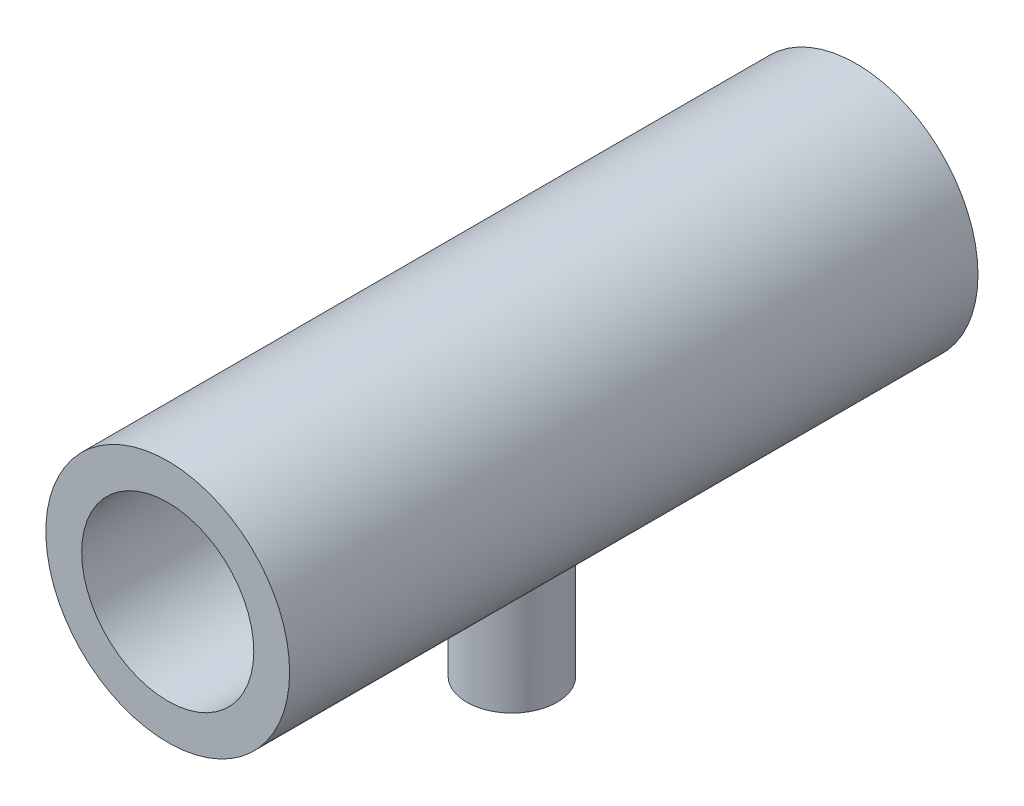
ISO-10303-21;
HEADER;
FILE_DESCRIPTION(('STEP AP214'),'2;1');
FILE_NAME('part.step','',(''),(''),'','','');
FILE_SCHEMA(('AUTOMOTIVE_DESIGN { 1 0 10303 214 1 1 1 1 }'));
ENDSEC;
DATA;
#1=APPLICATION_CONTEXT('core data for automotive mechanical design processes');
#2=APPLICATION_PROTOCOL_DEFINITION('international standard','automotive_design',2000,#1);
#3=PRODUCT_CONTEXT('',#1,'mechanical');
#4=PRODUCT('Part','Part','',(#3));
#5=PRODUCT_RELATED_PRODUCT_CATEGORY('part','',(#4));
#6=PRODUCT_DEFINITION_FORMATION('','',#4);
#7=PRODUCT_DEFINITION_CONTEXT('part definition',#1,'design');
#8=PRODUCT_DEFINITION('design','',#6,#7);
#9=PRODUCT_DEFINITION_SHAPE('','',#8);
#10=(LENGTH_UNIT() NAMED_UNIT(*) SI_UNIT(.MILLI.,.METRE.));
#11=(NAMED_UNIT(*) PLANE_ANGLE_UNIT() SI_UNIT($,.RADIAN.));
#12=(NAMED_UNIT(*) SI_UNIT($,.STERADIAN.) SOLID_ANGLE_UNIT());
#13=UNCERTAINTY_MEASURE_WITH_UNIT(LENGTH_MEASURE(1.E-05),#10,'distance_accuracy_value','');
#14=(GEOMETRIC_REPRESENTATION_CONTEXT(3) GLOBAL_UNCERTAINTY_ASSIGNED_CONTEXT((#13)) GLOBAL_UNIT_ASSIGNED_CONTEXT((#10,
#11,#12)) REPRESENTATION_CONTEXT('',''));
#15=CARTESIAN_POINT('',(0.,0.,0.));
#16=DIRECTION('',(0.,0.,1.));
#17=DIRECTION('',(1.,0.,0.));
#18=AXIS2_PLACEMENT_3D('',#15,#16,#17);
#19=CARTESIAN_POINT('',(0.,0.,0.));
#20=DIRECTION('',(0.,0.,1.));
#21=DIRECTION('',(1.,0.,0.));
#22=AXIS2_PLACEMENT_3D('',#19,#20,#21);
#23=PLANE('',#22);
#24=CARTESIAN_POINT('',(0.,0.,0.));
#25=DIRECTION('',(0.,0.,1.));
#26=DIRECTION('',(1.,0.,0.));
#27=AXIS2_PLACEMENT_3D('',#24,#25,#26);
#28=CIRCLE('',#27,9.525);
#29=CARTESIAN_POINT('',(9.525,0.,0.));
#30=VERTEX_POINT('',#29);
#31=EDGE_CURVE('E72',#30,#30,#28,.F.);
#32=ORIENTED_EDGE('',*,*,#31,.F.);
#33=EDGE_LOOP('',(#32));
#34=FACE_BOUND('',#33,.T.);
#35=CARTESIAN_POINT('',(0.,0.,0.));
#36=DIRECTION('',(0.,0.,1.));
#37=DIRECTION('',(1.,0.,0.));
#38=AXIS2_PLACEMENT_3D('',#35,#36,#37);
#39=CIRCLE('',#38,13.49375);
#40=CARTESIAN_POINT('',(13.49375,0.,0.));
#41=VERTEX_POINT('',#40);
#42=EDGE_CURVE('E63',#41,#41,#39,.T.);
#43=ORIENTED_EDGE('',*,*,#42,.F.);
#44=EDGE_LOOP('',(#43));
#45=FACE_BOUND('',#44,.T.);
#46=ADVANCED_FACE('F48',(#34,#45),#23,.F.);
#47=CARTESIAN_POINT('',(0.,0.,76.2));
#48=DIRECTION('',(0.,0.,1.));
#49=DIRECTION('',(1.,0.,0.));
#50=AXIS2_PLACEMENT_3D('',#47,#48,#49);
#51=PLANE('',#50);
#52=CARTESIAN_POINT('',(0.,0.,76.2));
#53=DIRECTION('',(0.,0.,1.));
#54=DIRECTION('',(1.,0.,0.));
#55=AXIS2_PLACEMENT_3D('',#52,#53,#54);
#56=CIRCLE('',#55,9.525);
#57=CARTESIAN_POINT('',(9.525,0.,76.2));
#58=VERTEX_POINT('',#57);
#59=EDGE_CURVE('E67',#58,#58,#56,.F.);
#60=ORIENTED_EDGE('',*,*,#59,.T.);
#61=EDGE_LOOP('',(#60));
#62=FACE_BOUND('',#61,.T.);
#63=CARTESIAN_POINT('',(0.,0.,76.2));
#64=DIRECTION('',(0.,0.,1.));
#65=DIRECTION('',(1.,0.,0.));
#66=AXIS2_PLACEMENT_3D('',#63,#64,#65);
#67=CIRCLE('',#66,13.49375);
#68=CARTESIAN_POINT('',(13.49375,0.,76.2));
#69=VERTEX_POINT('',#68);
#70=EDGE_CURVE('E59',#69,#69,#67,.T.);
#71=ORIENTED_EDGE('',*,*,#70,.T.);
#72=EDGE_LOOP('',(#71));
#73=FACE_BOUND('',#72,.T.);
#74=ADVANCED_FACE('F107',(#62,#73),#51,.T.);
#75=CARTESIAN_POINT('',(0.,0.,0.));
#76=DIRECTION('',(0.,0.,1.));
#77=DIRECTION('',(1.,0.,0.));
#78=AXIS2_PLACEMENT_3D('',#75,#76,#77);
#79=CYLINDRICAL_SURFACE('',#78,13.49375);
#80=CARTESIAN_POINT('',(0.,-13.49375,33.1));
#81=CARTESIAN_POINT('',(0.135472263766896,-13.4937504047586,33.099999447523));
#82=CARTESIAN_POINT('',(0.270936719021856,-13.4917054381509,33.1055100519968));
#83=CARTESIAN_POINT('',(0.540897583804265,-13.4835810536506,33.127498171873));
#84=CARTESIAN_POINT('',(0.675393664825697,-13.477500326371,33.1439792466075));
#85=CARTESIAN_POINT('',(0.942310386844938,-13.4614712549176,33.1877365253395));
#86=CARTESIAN_POINT('',(1.07473204519487,-13.4515248725417,33.215007253776));
#87=CARTESIAN_POINT('',(1.3366805352037,-13.4280258235397,33.2800924699581));
#88=CARTESIAN_POINT('',(1.46620622177745,-13.4144717568233,33.3179110514468));
#89=CARTESIAN_POINT('',(1.72114562784744,-13.3841465762195,33.4036508748567));
#90=CARTESIAN_POINT('',(1.84656821819204,-13.3673830252288,33.4515483923419));
#91=CARTESIAN_POINT('',(2.09283666142042,-13.3310484918267,33.5570921209125));
#92=CARTESIAN_POINT('',(2.21368079728954,-13.3114764690991,33.6147419458766));
#93=CARTESIAN_POINT('',(2.5681876023103,-13.2492666322519,33.8016694459962));
#94=CARTESIAN_POINT('',(2.79402331790806,-13.203110276009,33.9449924254238));
#95=CARTESIAN_POINT('',(3.22723300149498,-13.1041075203142,34.2709870793335));
#96=CARTESIAN_POINT('',(3.43359656584444,-13.0510751054286,34.4549331911834));
#97=CARTESIAN_POINT('',(3.8134577813909,-12.9451815395335,34.8544787922298));
#98=CARTESIAN_POINT('',(3.98694571510977,-12.8923204436871,35.0700876070615));
#99=CARTESIAN_POINT('',(4.22192057027709,-12.8165445656587,35.4174669978948));
#100=CARTESIAN_POINT('',(4.2971468004325,-12.7914536359554,35.5396919216222));
#101=CARTESIAN_POINT('',(4.43697685467614,-12.7436249861082,35.7904945294159));
#102=CARTESIAN_POINT('',(4.50158493073593,-12.7208863253716,35.9190696436333));
#103=CARTESIAN_POINT('',(4.61963908887273,-12.6784921854404,36.1817508789962));
#104=CARTESIAN_POINT('',(4.67308378857885,-12.6588370881613,36.3158576826765));
#105=CARTESIAN_POINT('',(4.76827655397109,-12.6232884382921,36.588582441897));
#106=CARTESIAN_POINT('',(4.81003022532708,-12.6073930835323,36.7271981997519));
#107=CARTESIAN_POINT('',(4.88000904594543,-12.5804670360074,37.0023419146719));
#108=CARTESIAN_POINT('',(4.90870664494604,-12.5692678542398,37.1387332582223));
#109=CARTESIAN_POINT('',(4.95462966434852,-12.5512367805003,37.4136633746138));
#110=CARTESIAN_POINT('',(4.97186007452148,-12.5444029890481,37.5522011865635));
#111=CARTESIAN_POINT('',(4.99467392479897,-12.5353369675417,37.8303637758437));
#112=CARTESIAN_POINT('',(5.00025899542194,-12.5331040932921,37.9699883982566));
#113=CARTESIAN_POINT('',(4.99972257812551,-12.5333181640281,38.2492087065206));
#114=CARTESIAN_POINT('',(4.99360152939513,-12.5357649334432,38.3888043932609));
#115=CARTESIAN_POINT('',(4.97042394304303,-12.5449717730697,38.6586993792835));
#116=CARTESIAN_POINT('',(4.95402783840827,-12.5514712368139,38.7890649312953));
#117=CARTESIAN_POINT('',(4.91107966929416,-12.5683378809915,39.0478999017767));
#118=CARTESIAN_POINT('',(4.88452422622037,-12.5787063480741,39.1763686746752));
#119=CARTESIAN_POINT('',(4.8215094087587,-12.6029946931011,39.4304780344342));
#120=CARTESIAN_POINT('',(4.78505262824303,-12.6169136408613,39.5561193526868));
#121=CARTESIAN_POINT('',(4.7025551218034,-12.6478930163703,39.8038330522736));
#122=CARTESIAN_POINT('',(4.65651072108387,-12.664954648374,39.9259040446338));
#123=CARTESIAN_POINT('',(4.50266181669429,-12.720826626554,40.2900162032141));
#124=CARTESIAN_POINT('',(4.38026596576647,-12.7638674382975,40.5254355046147));
#125=CARTESIAN_POINT('',(4.10066395296738,-12.8564171799128,40.9730385980973));
#126=CARTESIAN_POINT('',(3.94344597502435,-12.9059283029894,41.1852144664523));
#127=CARTESIAN_POINT('',(3.58648022226262,-13.0098101229415,41.5950970557192));
#128=CARTESIAN_POINT('',(3.38462135054272,-13.0642867142455,41.7909459533316));
#129=CARTESIAN_POINT('',(2.950296940384,-13.1691645737841,42.1465478433897));
#130=CARTESIAN_POINT('',(2.71782692563034,-13.2195652442472,42.3062955474042));
#131=CARTESIAN_POINT('',(2.22422044759276,-13.3115737219616,42.5871608199889));
#132=CARTESIAN_POINT('',(1.9627110968935,-13.3530405701806,42.7076725782912));
#133=CARTESIAN_POINT('',(1.4212133077671,-13.4214661858779,42.9023782024899));
#134=CARTESIAN_POINT('',(1.14123293301017,-13.4484312377894,42.976592134038));
#135=CARTESIAN_POINT('',(0.586406554196147,-13.4837175041064,43.073051856204));
#136=CARTESIAN_POINT('',(0.312052907850673,-13.4929367871492,43.0978035133882));
#137=CARTESIAN_POINT('',(-0.237009928274288,-13.4944588786964,43.1019149110087));
#138=CARTESIAN_POINT('',(-0.511719028675213,-13.4867653329117,43.0812844339678));
#139=CARTESIAN_POINT('',(-1.04295655533747,-13.4559189210102,42.9971306584322));
#140=CARTESIAN_POINT('',(-1.29978084921344,-13.4333538854439,42.9352373339997));
#141=CARTESIAN_POINT('',(-1.79922685014387,-13.3756242291879,42.7724517274125));
#142=CARTESIAN_POINT('',(-2.04184670441226,-13.3404579690716,42.6715543706764));
#143=CARTESIAN_POINT('',(-2.5139137969109,-13.2597347374392,42.430417550935));
#144=CARTESIAN_POINT('',(-2.74277192112757,-13.2139050720553,42.2891182591343));
#145=CARTESIAN_POINT('',(-3.17426860006701,-13.116947321847,41.9724344164635));
#146=CARTESIAN_POINT('',(-3.37689759533655,-13.0658173174219,41.7970374963324));
#147=CARTESIAN_POINT('',(-3.76227648795759,-12.9602748304356,41.4052769874546));
#148=CARTESIAN_POINT('',(-3.94325120576829,-12.905840409654,41.1871561418677));
#149=CARTESIAN_POINT('',(-4.18545795646225,-12.8285014878535,40.8389821660475));
#150=CARTESIAN_POINT('',(-4.26135430699551,-12.8034269163174,40.7193474775108));
#151=CARTESIAN_POINT('',(-4.40287806593898,-12.7554508690349,40.4737555070419));
#152=CARTESIAN_POINT('',(-4.46850980156466,-12.7325484791812,40.3478009191052));
#153=CARTESIAN_POINT('',(-4.5892026737336,-12.6895482297063,40.0898688497315));
#154=CARTESIAN_POINT('',(-4.64422253384034,-12.6694614011826,39.9578702266958));
#155=CARTESIAN_POINT('',(-4.74286096791881,-12.632866941956,39.6892536960719));
#156=CARTESIAN_POINT('',(-4.78648437385461,-12.6163577948656,39.5526377740031));
#157=CARTESIAN_POINT('',(-4.86190286498263,-12.587486751904,39.2757883122811));
#158=CARTESIAN_POINT('',(-4.89370132181523,-12.5751236739656,39.1355558160331));
#159=CARTESIAN_POINT('',(-4.94513304983775,-12.5549876361743,38.8525544176311));
#160=CARTESIAN_POINT('',(-4.96476714150038,-12.5472143667457,38.7097856872115));
#161=CARTESIAN_POINT('',(-4.99079417786854,-12.5368833105471,38.4319578776377));
#162=CARTESIAN_POINT('',(-4.99794393771503,-12.5340275838622,38.2969802656033));
#163=CARTESIAN_POINT('',(-5.00128971675748,-12.5326930349103,38.0268192673743));
#164=CARTESIAN_POINT('',(-4.99748203859668,-12.534215690036,37.8916358271095));
#165=CARTESIAN_POINT('',(-4.9789493896406,-12.541588827641,37.6222038699998));
#166=CARTESIAN_POINT('',(-4.96422951291793,-12.5474372907278,37.4879549464078));
#167=CARTESIAN_POINT('',(-4.9240268362425,-12.5632684466323,37.2212780101522));
#168=CARTESIAN_POINT('',(-4.89853998441636,-12.5732526958188,37.088850702399));
#169=CARTESIAN_POINT('',(-4.83796233915873,-12.5966833351778,36.8306803485185));
#170=CARTESIAN_POINT('',(-4.80317748698354,-12.610018741079,36.7048554069793));
#171=CARTESIAN_POINT('',(-4.72401808055802,-12.6398862263632,36.4566343272629));
#172=CARTESIAN_POINT('',(-4.67964016111743,-12.6564194272988,36.3342394093808));
#173=CARTESIAN_POINT('',(-4.53263275739436,-12.7101325245137,35.9733632413683));
#174=CARTESIAN_POINT('',(-4.41608371340164,-12.7514446125416,35.7409967078595));
#175=CARTESIAN_POINT('',(-4.14240107893058,-12.8430380172178,35.2867185258127));
#176=CARTESIAN_POINT('',(-3.98348611330648,-12.8936717431821,35.0659620651607));
#177=CARTESIAN_POINT('',(-3.63217475789984,-12.9969996592144,34.6531653524389));
#178=CARTESIAN_POINT('',(-3.43976785609895,-13.0496944921582,34.461134151575));
#179=CARTESIAN_POINT('',(-3.12414362977029,-13.1275911234132,34.1935745921251));
#180=CARTESIAN_POINT('',(-3.01127612341515,-13.154001921601,34.1059203707229));
#181=CARTESIAN_POINT('',(-2.77821796099427,-13.2051884019923,33.940444963254));
#182=CARTESIAN_POINT('',(-2.65803001642271,-13.2299646826233,33.8626201687993));
#183=CARTESIAN_POINT('',(-2.41102079712997,-13.2772018975091,33.7173610457256));
#184=CARTESIAN_POINT('',(-2.28419628779173,-13.2996616865758,33.649931848234));
#185=CARTESIAN_POINT('',(-2.0248629087671,-13.3416063969366,33.5260995765089));
#186=CARTESIAN_POINT('',(-1.89235649929868,-13.3610925894412,33.4696917877226));
#187=CARTESIAN_POINT('',(-1.61796678035203,-13.3971361946398,33.3666735424351));
#188=CARTESIAN_POINT('',(-1.47591786073427,-13.413571808727,33.3204604220857));
#189=CARTESIAN_POINT('',(-1.18790920127706,-13.4421386015475,33.2408661531572));
#190=CARTESIAN_POINT('',(-1.04195119017276,-13.4542716502905,33.207479429357));
#191=CARTESIAN_POINT('',(-0.747343776928926,-13.473847107025,33.1539015860132));
#192=CARTESIAN_POINT('',(-0.598694803411213,-13.4812902553869,33.1337083836579));
#193=CARTESIAN_POINT('',(-0.300027270267447,-13.4912412328825,33.1067585632716));
#194=CARTESIAN_POINT('',(-0.150008848047401,-13.4937495518096,33.1000006117595));
#195=CARTESIAN_POINT('',(0.,-13.49375,33.1));
#196=B_SPLINE_CURVE_WITH_KNOTS('',3,(#80,#81,#82,#83,#84,#85,#86,#87,#88,#89,#90,#91,#92,#93,
#94,#95,#96,#97,#98,#99,#100,#101,#102,#103,#104,#105,#106,#107,#108,#109,#110,#111,#112,#113,
#114,#115,#116,#117,#118,#119,#120,#121,#122,#123,#124,#125,#126,#127,#128,#129,#130,#131,#132,
#133,#134,#135,#136,#137,#138,#139,#140,#141,#142,#143,#144,#145,#146,#147,#148,#149,#150,#151,
#152,#153,#154,#155,#156,#157,#158,#159,#160,#161,#162,#163,#164,#165,#166,#167,#168,#169,#170,
#171,#172,#173,#174,#175,#176,#177,#178,#179,#180,#181,#182,#183,#184,#185,#186,#187,#188,#189,
#190,#191,#192,#193,#194,#195),.UNSPECIFIED.,.T.,.F.,(4,2,2,2,2,2,2,2,2,2,2,2,2,2,2,2,2,2,2,2,2,
2,2,2,2,2,2,2,2,2,2,2,2,2,2,2,2,2,2,2,2,2,2,2,2,2,2,2,2,2,2,2,2,2,2,2,2,4),(0.,
0.406276461308086,0.81268480193363,1.21888716141383,1.62524739261097,2.03066159815814,
2.43622636706026,3.24672983203674,4.08763877565035,4.92879589128016,5.36543558124401,
5.80189999335569,6.23841842124705,6.67472718537942,7.09366427416523,7.51241894951417,
7.93111498912467,8.34979532044742,8.7439915077748,9.13831890329272,9.53254309559061,
9.92691866735019,10.7295487052551,11.5324515152231,12.3879407855303,13.2435552945733,
14.1118150012539,14.9796981390084,15.8023690098814,16.6248625641038,17.4166517699387,
18.2085440254211,19.0234901503946,19.8387324588731,20.7001343967812,21.1313519325892,
21.5623871887543,21.995066625698,22.4275623127628,22.8599345878774,23.2922776967941,
23.6973610795579,24.1025811652061,24.5076122035524,24.9127958008545,25.3060102492091,
25.6993628593184,26.4854747123482,27.312082004202,28.1389492102839,28.5744922438891,
29.0098749217897,29.44547181544,29.880881966867,30.3310647374999,30.7810516061912,
31.2309674199674,31.6808385762837),.UNSPECIFIED.);
#197=CARTESIAN_POINT('',(0.,-13.49375,33.1));
#198=VERTEX_POINT('',#197);
#199=EDGE_CURVE('E11',#198,#198,#196,.T.);
#200=ORIENTED_EDGE('',*,*,#199,.F.);
#201=EDGE_LOOP('',(#200));
#202=FACE_BOUND('',#201,.T.);
#203=ORIENTED_EDGE('',*,*,#70,.F.);
#204=EDGE_LOOP('',(#203));
#205=FACE_BOUND('',#204,.T.);
#206=ORIENTED_EDGE('',*,*,#42,.T.);
#207=EDGE_LOOP('',(#206));
#208=FACE_BOUND('',#207,.T.);
#209=ADVANCED_FACE('F103',(#202,#205,#208),#79,.T.);
#210=CARTESIAN_POINT('',(0.,0.,-4.99999999999999));
#211=DIRECTION('',(0.,0.,1.));
#212=DIRECTION('',(1.,0.,0.));
#213=AXIS2_PLACEMENT_3D('',#210,#211,#212);
#214=CYLINDRICAL_SURFACE('',#213,9.525);
#215=CARTESIAN_POINT('',(0.,-9.525,34.37));
#216=CARTESIAN_POINT('',(-0.100651405892543,-9.52500052462911,34.3699992983465));
#217=CARTESIAN_POINT('',(-0.201293680645754,-9.52340118028469,34.3740772253932));
#218=CARTESIAN_POINT('',(-0.401852755465586,-9.51704824657607,34.3903451657601));
#219=CARTESIAN_POINT('',(-0.501769328071407,-9.51229370803081,34.402537620187));
#220=CARTESIAN_POINT('',(-0.700046994451151,-9.49975872031225,34.4349059259878));
#221=CARTESIAN_POINT('',(-0.798409016376606,-9.49198015361161,34.4550768108848));
#222=CARTESIAN_POINT('',(-0.992955517367152,-9.47360744939083,34.503195969695));
#223=CARTESIAN_POINT('',(-1.08913913258594,-9.46301221542522,34.5311472724953));
#224=CARTESIAN_POINT('',(-1.37295527648324,-9.42744743788297,34.6261626146281));
#225=CARTESIAN_POINT('',(-1.55647984698465,-9.39865664754902,34.7044918931667));
#226=CARTESIAN_POINT('',(-1.90765108699512,-9.3337296647856,34.8885877253639));
#227=CARTESIAN_POINT('',(-2.07529310531261,-9.29759133032194,34.9943622826512));
#228=CARTESIAN_POINT('',(-2.39774379721645,-9.2198189773798,35.2354111963065));
#229=CARTESIAN_POINT('',(-2.55173966680187,-9.17801992588785,35.3717210145505));
#230=CARTESIAN_POINT('',(-2.83534678381793,-9.09441285181886,35.6677654843873));
#231=CARTESIAN_POINT('',(-2.96494955385709,-9.05260483115968,35.8275082454934));
#232=CARTESIAN_POINT('',(-3.20151549043331,-8.97174642445843,36.1741132220037));
#233=CARTESIAN_POINT('',(-3.30728872756283,-8.93288756369934,36.3618369169055));
#234=CARTESIAN_POINT('',(-3.48539542841514,-8.86491965899965,36.7541653527813));
#235=CARTESIAN_POINT('',(-3.55774362791902,-8.83580632020496,36.958762607894));
#236=CARTESIAN_POINT('',(-3.66366758367955,-8.79240185585317,37.3696306484638));
#237=CARTESIAN_POINT('',(-3.69880650704137,-8.77751595839112,37.5754333690154));
#238=CARTESIAN_POINT('',(-3.73419920942428,-8.76252184041024,37.9905113811915));
#239=CARTESIAN_POINT('',(-3.73446912371468,-8.76240678483896,38.1997850218458));
#240=CARTESIAN_POINT('',(-3.70130418350233,-8.77645819664139,38.601097249407));
#241=CARTESIAN_POINT('',(-3.67009969579149,-8.78967960685426,38.7933595762392));
#242=CARTESIAN_POINT('',(-3.57857979282518,-8.82733335399368,39.1696621693541));
#243=CARTESIAN_POINT('',(-3.51825957746263,-8.85176753945959,39.3537010744305));
#244=CARTESIAN_POINT('',(-3.36909015178542,-8.90962076782536,39.7126605749337));
#245=CARTESIAN_POINT('',(-3.27969629997414,-8.94320917910969,39.8873263298867));
#246=CARTESIAN_POINT('',(-3.07529844441543,-9.01553637236328,40.219800724642));
#247=CARTESIAN_POINT('',(-2.96028506116557,-9.05427703851315,40.3776031592668));
#248=CARTESIAN_POINT('',(-2.69792792840557,-9.13602851190343,40.6841280351537));
#249=CARTESIAN_POINT('',(-2.54882436325954,-9.17914343343307,40.8313203882468));
#250=CARTESIAN_POINT('',(-2.22757671925522,-9.26234492000433,41.0990890823483));
#251=CARTESIAN_POINT('',(-2.05542843922743,-9.30243093077043,41.2196605595912));
#252=CARTESIAN_POINT('',(-1.68878829345459,-9.37598845016957,41.432661093296));
#253=CARTESIAN_POINT('',(-1.49394639062381,-9.40932609269898,41.5245371973486));
#254=CARTESIAN_POINT('',(-1.08993741299003,-9.46462539056442,41.6736871876317));
#255=CARTESIAN_POINT('',(-0.880777355900186,-9.48659257430449,41.7309778918056));
#256=CARTESIAN_POINT('',(-0.466912838989599,-9.51568039268789,41.8062888365141));
#257=CARTESIAN_POINT('',(-0.26263716740733,-9.52357793970035,41.8263667420051));
#258=CARTESIAN_POINT('',(0.146496098306535,-9.52606802209582,41.8327291324414));
#259=CARTESIAN_POINT('',(0.351353536848543,-9.52066383148959,41.8190219330508));
#260=CARTESIAN_POINT('',(0.746657969198178,-9.49766784980678,41.7597343246151));
#261=CARTESIAN_POINT('',(0.937346855414826,-9.48060599017158,41.7155390252043));
#262=CARTESIAN_POINT('',(1.30844115871173,-9.43655384439365,41.5983935159404));
#263=CARTESIAN_POINT('',(1.4888452435038,-9.40956227532117,41.525439590353));
#264=CARTESIAN_POINT('',(1.84037937841827,-9.347270964359,41.3504796916679));
#265=CARTESIAN_POINT('',(2.01106391856853,-9.3117446357825,41.2476617865084));
#266=CARTESIAN_POINT('',(2.333348489496,-9.2362628276715,41.0167986885089));
#267=CARTESIAN_POINT('',(2.4849410214516,-9.19630561932341,40.8887436335381));
#268=CARTESIAN_POINT('',(2.77479603688113,-9.11319337387035,40.6015230444781));
#269=CARTESIAN_POINT('',(2.91160715284838,-9.06999602754685,40.4409012459024));
#270=CARTESIAN_POINT('',(3.15666627869723,-8.98764937766449,40.0981836299847));
#271=CARTESIAN_POINT('',(3.26491037103394,-8.94850062975824,39.9160848723446));
#272=CARTESIAN_POINT('',(3.45023565293435,-8.87870653324524,39.533286770648));
#273=CARTESIAN_POINT('',(3.52707182283939,-8.84812860680792,39.3324556498644));
#274=CARTESIAN_POINT('',(3.64527043368796,-8.80010094867894,38.9191550958775));
#275=CARTESIAN_POINT('',(3.68665758411159,-8.78264207349171,38.7066938794291));
#276=CARTESIAN_POINT('',(3.73047358013948,-8.76411461042352,38.2920469114538));
#277=CARTESIAN_POINT('',(3.73540613791323,-8.76199290185607,38.0901709513612));
#278=CARTESIAN_POINT('',(3.71269304365561,-8.77164102217198,37.6886181934577));
#279=CARTESIAN_POINT('',(3.68505110613786,-8.78340926716545,37.4889411475221));
#280=CARTESIAN_POINT('',(3.59998724792046,-8.81859980126503,37.1048626093572));
#281=CARTESIAN_POINT('',(3.5436833394783,-8.84158331525959,36.9201697129403));
#282=CARTESIAN_POINT('',(3.40391792043066,-8.89632345896355,36.5627662934861));
#283=CARTESIAN_POINT('',(3.32044927205848,-8.92808239415809,36.3900589342371));
#284=CARTESIAN_POINT('',(3.12334812813379,-8.99899220983934,36.0510597733998));
#285=CARTESIAN_POINT('',(3.00829492929334,-9.03845620449195,35.8856605728758));
#286=CARTESIAN_POINT('',(2.75339630878553,-9.11933589859915,35.5757199987418));
#287=CARTESIAN_POINT('',(2.61354265893398,-9.16075224243705,35.4311855765157));
#288=CARTESIAN_POINT('',(2.30286186017562,-9.24390901292306,35.1580463933767));
#289=CARTESIAN_POINT('',(2.13066398887716,-9.28551450747495,35.0309553463061));
#290=CARTESIAN_POINT('',(1.76573339544804,-9.36175305005308,34.8074656530583));
#291=CARTESIAN_POINT('',(1.57299582558216,-9.39638444646968,34.7110742740572));
#292=CARTESIAN_POINT('',(1.26449170757242,-9.44133319272995,34.5889319121086));
#293=CARTESIAN_POINT('',(1.15394087046321,-9.45551904839319,34.5510539991906));
#294=CARTESIAN_POINT('',(0.929408280973947,-9.48021849589552,34.4857584187692));
#295=CARTESIAN_POINT('',(0.81542810590359,-9.49073374879333,34.4583360193102));
#296=CARTESIAN_POINT('',(0.58513551029578,-9.50771149281554,34.4143164688842));
#297=CARTESIAN_POINT('',(0.468823698940013,-9.5141750286416,34.3977165273921));
#298=CARTESIAN_POINT('',(0.235003641576222,-9.52281861736003,34.3755596271293));
#299=CARTESIAN_POINT('',(0.117495599239708,-9.52499938757327,34.3700008190764));
#300=CARTESIAN_POINT('',(0.,-9.525,34.37));
#301=B_SPLINE_CURVE_WITH_KNOTS('',3,(#215,#216,#217,#218,#219,#220,#221,#222,#223,#224,#225,
#226,#227,#228,#229,#230,#231,#232,#233,#234,#235,#236,#237,#238,#239,#240,#241,#242,#243,#244,
#245,#246,#247,#248,#249,#250,#251,#252,#253,#254,#255,#256,#257,#258,#259,#260,#261,#262,#263,
#264,#265,#266,#267,#268,#269,#270,#271,#272,#273,#274,#275,#276,#277,#278,#279,#280,#281,#282,
#283,#284,#285,#286,#287,#288,#289,#290,#291,#292,#293,#294,#295,#296,#297,#298,#299,#300),
.UNSPECIFIED.,.T.,.F.,(4,2,2,2,2,2,2,2,2,2,2,2,2,2,2,2,2,2,2,2,2,2,2,2,2,2,2,2,2,2,2,2,2,2,2,2,
2,2,2,2,2,2,4),(0.,0.301842985507916,0.603776816012013,0.905522991383765,1.20738680007401,
1.80922849133017,2.41124589010567,3.0380552874484,3.66508212072926,4.31863922776608,
4.97190793165463,5.59648832565288,6.22077970056951,6.80373753546923,7.38679151140696,
7.98146615731992,8.57635887695323,9.21516429276264,9.85408632507201,10.5046528861673,
11.1549028389992,11.7679815394825,12.3809093555035,12.9676812658995,13.5545290145337,
14.1591256927435,14.7639591043718,15.4070814621194,16.0502919688149,16.6984286946032,
17.3461132729034,17.94886138747,18.5515407765068,19.13233199497,19.7132759446491,
20.3265656004455,20.9400591127689,21.5910523119761,22.2421994989062,22.5948662090615,
22.9473731193444,23.299789101217,23.6521460518632),.UNSPECIFIED.);
#302=CARTESIAN_POINT('',(0.,-9.525,34.37));
#303=VERTEX_POINT('',#302);
#304=EDGE_CURVE('E81',#303,#303,#301,.T.);
#305=ORIENTED_EDGE('',*,*,#304,.F.);
#306=EDGE_LOOP('',(#305));
#307=FACE_BOUND('',#306,.T.);
#308=ORIENTED_EDGE('',*,*,#31,.T.);
#309=EDGE_LOOP('',(#308));
#310=FACE_BOUND('',#309,.T.);
#311=ORIENTED_EDGE('',*,*,#59,.F.);
#312=EDGE_LOOP('',(#311));
#313=FACE_BOUND('',#312,.T.);
#314=ADVANCED_FACE('F101',(#307,#310,#313),#214,.F.);
#315=CARTESIAN_POINT('',(0.,-10.95375,38.1));
#316=DIRECTION('',(0.,-1.,0.));
#317=DIRECTION('',(0.,0.,-1.));
#318=AXIS2_PLACEMENT_3D('',#315,#316,#317);
#319=CYLINDRICAL_SURFACE('',#318,5.);
#320=ORIENTED_EDGE('',*,*,#199,.T.);
#321=EDGE_LOOP('',(#320));
#322=FACE_BOUND('',#321,.T.);
#323=CARTESIAN_POINT('',(0.,-26.19375,38.1));
#324=DIRECTION('',(0.,-1.,0.));
#325=DIRECTION('',(0.,0.,-1.));
#326=AXIS2_PLACEMENT_3D('',#323,#324,#325);
#327=CIRCLE('',#326,5.);
#328=CARTESIAN_POINT('',(0.,-26.19375,33.1));
#329=VERTEX_POINT('',#328);
#330=EDGE_CURVE('E75',#329,#329,#327,.T.);
#331=ORIENTED_EDGE('',*,*,#330,.F.);
#332=EDGE_LOOP('',(#331));
#333=FACE_BOUND('',#332,.T.);
#334=ADVANCED_FACE('F96',(#322,#333),#319,.T.);
#335=CARTESIAN_POINT('',(0.,-26.19375,38.1));
#336=DIRECTION('',(0.,-1.,0.));
#337=DIRECTION('',(0.,0.,-1.));
#338=AXIS2_PLACEMENT_3D('',#335,#336,#337);
#339=PLANE('',#338);
#340=CARTESIAN_POINT('',(0.,-26.19375,38.1));
#341=DIRECTION('',(0.,-1.,0.));
#342=DIRECTION('',(0.,0.,-1.));
#343=AXIS2_PLACEMENT_3D('',#340,#341,#342);
#344=CIRCLE('',#343,3.73);
#345=CARTESIAN_POINT('',(0.,-26.19375,34.37));
#346=VERTEX_POINT('',#345);
#347=EDGE_CURVE('E78',#346,#346,#344,.T.);
#348=ORIENTED_EDGE('',*,*,#347,.F.);
#349=EDGE_LOOP('',(#348));
#350=FACE_BOUND('',#349,.T.);
#351=ORIENTED_EDGE('',*,*,#330,.T.);
#352=EDGE_LOOP('',(#351));
#353=FACE_BOUND('',#352,.T.);
#354=ADVANCED_FACE('F93',(#350,#353),#339,.T.);
#355=CARTESIAN_POINT('',(0.,13.49475,38.1));
#356=DIRECTION('',(0.,-1.,0.));
#357=DIRECTION('',(0.,0.,-1.));
#358=AXIS2_PLACEMENT_3D('',#355,#356,#357);
#359=CYLINDRICAL_SURFACE('',#358,3.73);
#360=ORIENTED_EDGE('',*,*,#347,.T.);
#361=EDGE_LOOP('',(#360));
#362=FACE_BOUND('',#361,.T.);
#363=ORIENTED_EDGE('',*,*,#304,.T.);
#364=EDGE_LOOP('',(#363));
#365=FACE_BOUND('',#364,.T.);
#366=ADVANCED_FACE('F88',(#362,#365),#359,.F.);
#367=CLOSED_SHELL('',(#46,#74,#209,#314,#334,#354,#366));
#368=MANIFOLD_SOLID_BREP('B2',#367);
#369=ADVANCED_BREP_SHAPE_REPRESENTATION('',(#18,#368),#14);
#370=SHAPE_DEFINITION_REPRESENTATION(#9,#369);
ENDSEC;
END-ISO-10303-21;
